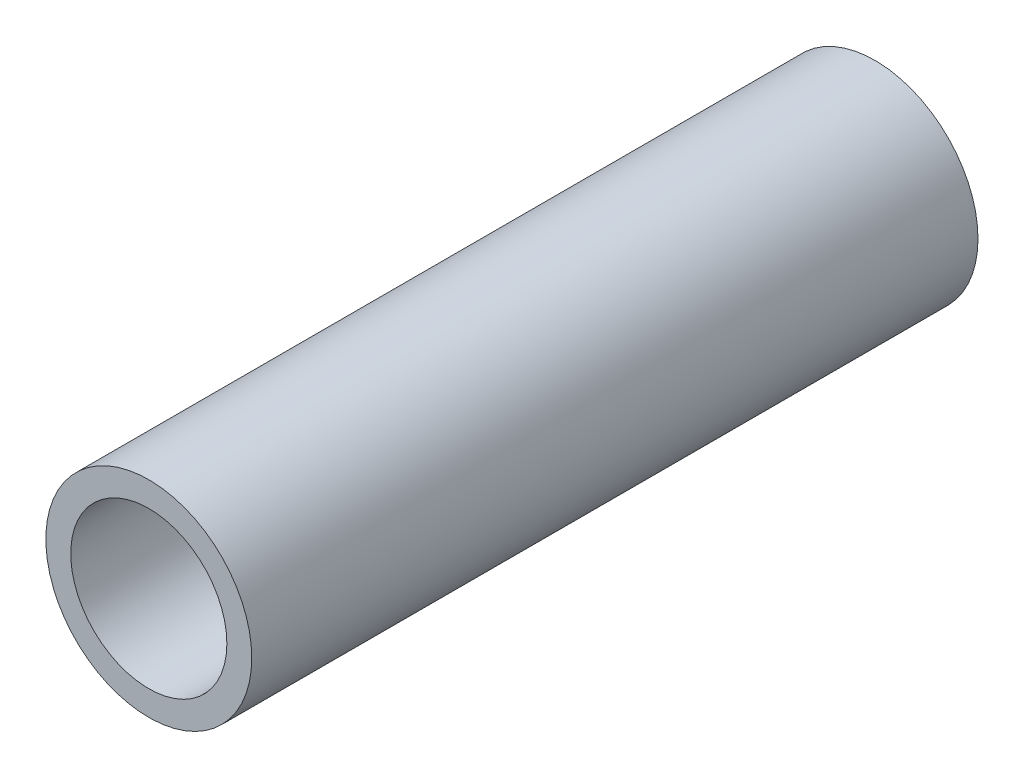
ISO-10303-21;
HEADER;
FILE_DESCRIPTION(('STEP AP214'),'2;1');
FILE_NAME('part.step','',(''),(''),'','','');
FILE_SCHEMA(('AUTOMOTIVE_DESIGN { 1 0 10303 214 1 1 1 1 }'));
ENDSEC;
DATA;
#1=APPLICATION_CONTEXT('core data for automotive mechanical design processes');
#2=APPLICATION_PROTOCOL_DEFINITION('international standard','automotive_design',2000,#1);
#3=PRODUCT_CONTEXT('',#1,'mechanical');
#4=PRODUCT('Part','Part','',(#3));
#5=PRODUCT_RELATED_PRODUCT_CATEGORY('part','',(#4));
#6=PRODUCT_DEFINITION_FORMATION('','',#4);
#7=PRODUCT_DEFINITION_CONTEXT('part definition',#1,'design');
#8=PRODUCT_DEFINITION('design','',#6,#7);
#9=PRODUCT_DEFINITION_SHAPE('','',#8);
#10=(LENGTH_UNIT() NAMED_UNIT(*) SI_UNIT(.MILLI.,.METRE.));
#11=(NAMED_UNIT(*) PLANE_ANGLE_UNIT() SI_UNIT($,.RADIAN.));
#12=(NAMED_UNIT(*) SI_UNIT($,.STERADIAN.) SOLID_ANGLE_UNIT());
#13=UNCERTAINTY_MEASURE_WITH_UNIT(LENGTH_MEASURE(1.E-05),#10,'distance_accuracy_value','');
#14=(GEOMETRIC_REPRESENTATION_CONTEXT(3) GLOBAL_UNCERTAINTY_ASSIGNED_CONTEXT((#13)) GLOBAL_UNIT_ASSIGNED_CONTEXT((#10,
#11,#12)) REPRESENTATION_CONTEXT('',''));
#15=CARTESIAN_POINT('',(0.,0.,0.));
#16=DIRECTION('',(0.,0.,1.));
#17=DIRECTION('',(1.,0.,0.));
#18=AXIS2_PLACEMENT_3D('',#15,#16,#17);
#19=CARTESIAN_POINT('',(0.,0.,1828.8));
#20=DIRECTION('',(0.,0.,1.));
#21=DIRECTION('',(1.,0.,0.));
#22=AXIS2_PLACEMENT_3D('',#19,#20,#21);
#23=PLANE('',#22);
#24=CARTESIAN_POINT('',(0.,0.,1828.8));
#25=DIRECTION('',(0.,0.,1.));
#26=DIRECTION('',(1.,0.,0.));
#27=AXIS2_PLACEMENT_3D('',#24,#25,#26);
#28=CIRCLE('',#27,259.265);
#29=CARTESIAN_POINT('',(259.265,0.,1828.8));
#30=VERTEX_POINT('',#29);
#31=EDGE_CURVE('E10',#30,#30,#28,.T.);
#32=ORIENTED_EDGE('',*,*,#31,.T.);
#33=EDGE_LOOP('',(#32));
#34=FACE_BOUND('',#33,.T.);
#35=CARTESIAN_POINT('',(0.,0.,1828.8));
#36=DIRECTION('',(0.,0.,1.));
#37=DIRECTION('',(1.,0.,0.));
#38=AXIS2_PLACEMENT_3D('',#35,#36,#37);
#39=CIRCLE('',#38,196.6);
#40=CARTESIAN_POINT('',(196.6,0.,1828.8));
#41=VERTEX_POINT('',#40);
#42=EDGE_CURVE('E43',#41,#41,#39,.T.);
#43=ORIENTED_EDGE('',*,*,#42,.F.);
#44=EDGE_LOOP('',(#43));
#45=FACE_BOUND('',#44,.T.);
#46=ADVANCED_FACE('F32',(#34,#45),#23,.T.);
#47=CARTESIAN_POINT('',(0.,0.,0.));
#48=DIRECTION('',(0.,0.,1.));
#49=DIRECTION('',(1.,0.,0.));
#50=AXIS2_PLACEMENT_3D('',#47,#48,#49);
#51=PLANE('',#50);
#52=CARTESIAN_POINT('',(0.,0.,0.));
#53=DIRECTION('',(0.,0.,1.));
#54=DIRECTION('',(1.,0.,0.));
#55=AXIS2_PLACEMENT_3D('',#52,#53,#54);
#56=CIRCLE('',#55,259.265);
#57=CARTESIAN_POINT('',(259.265,0.,0.));
#58=VERTEX_POINT('',#57);
#59=EDGE_CURVE('E36',#58,#58,#56,.T.);
#60=ORIENTED_EDGE('',*,*,#59,.F.);
#61=EDGE_LOOP('',(#60));
#62=FACE_BOUND('',#61,.T.);
#63=CARTESIAN_POINT('',(0.,0.,0.));
#64=DIRECTION('',(0.,0.,1.));
#65=DIRECTION('',(1.,0.,0.));
#66=AXIS2_PLACEMENT_3D('',#63,#64,#65);
#67=CIRCLE('',#66,196.6);
#68=CARTESIAN_POINT('',(196.6,0.,0.));
#69=VERTEX_POINT('',#68);
#70=EDGE_CURVE('E45',#69,#69,#67,.T.);
#71=ORIENTED_EDGE('',*,*,#70,.T.);
#72=EDGE_LOOP('',(#71));
#73=FACE_BOUND('',#72,.T.);
#74=ADVANCED_FACE('F55',(#62,#73),#51,.F.);
#75=CARTESIAN_POINT('',(0.,0.,1828.8));
#76=DIRECTION('',(0.,0.,-1.));
#77=DIRECTION('',(-1.,0.,0.));
#78=AXIS2_PLACEMENT_3D('',#75,#76,#77);
#79=CYLINDRICAL_SURFACE('',#78,259.265);
#80=ORIENTED_EDGE('',*,*,#31,.F.);
#81=EDGE_LOOP('',(#80));
#82=FACE_BOUND('',#81,.T.);
#83=ORIENTED_EDGE('',*,*,#59,.T.);
#84=EDGE_LOOP('',(#83));
#85=FACE_BOUND('',#84,.T.);
#86=ADVANCED_FACE('F34',(#82,#85),#79,.T.);
#87=CARTESIAN_POINT('',(0.,0.,1828.8));
#88=DIRECTION('',(0.,0.,-1.));
#89=DIRECTION('',(-1.,0.,0.));
#90=AXIS2_PLACEMENT_3D('',#87,#88,#89);
#91=CYLINDRICAL_SURFACE('',#90,196.6);
#92=ORIENTED_EDGE('',*,*,#42,.T.);
#93=EDGE_LOOP('',(#92));
#94=FACE_BOUND('',#93,.T.);
#95=ORIENTED_EDGE('',*,*,#70,.F.);
#96=EDGE_LOOP('',(#95));
#97=FACE_BOUND('',#96,.T.);
#98=ADVANCED_FACE('F51',(#94,#97),#91,.F.);
#99=CLOSED_SHELL('',(#46,#74,#86,#98));
#100=MANIFOLD_SOLID_BREP('B2',#99);
#101=ADVANCED_BREP_SHAPE_REPRESENTATION('',(#18,#100),#14);
#102=SHAPE_DEFINITION_REPRESENTATION(#9,#101);
ENDSEC;
END-ISO-10303-21;
